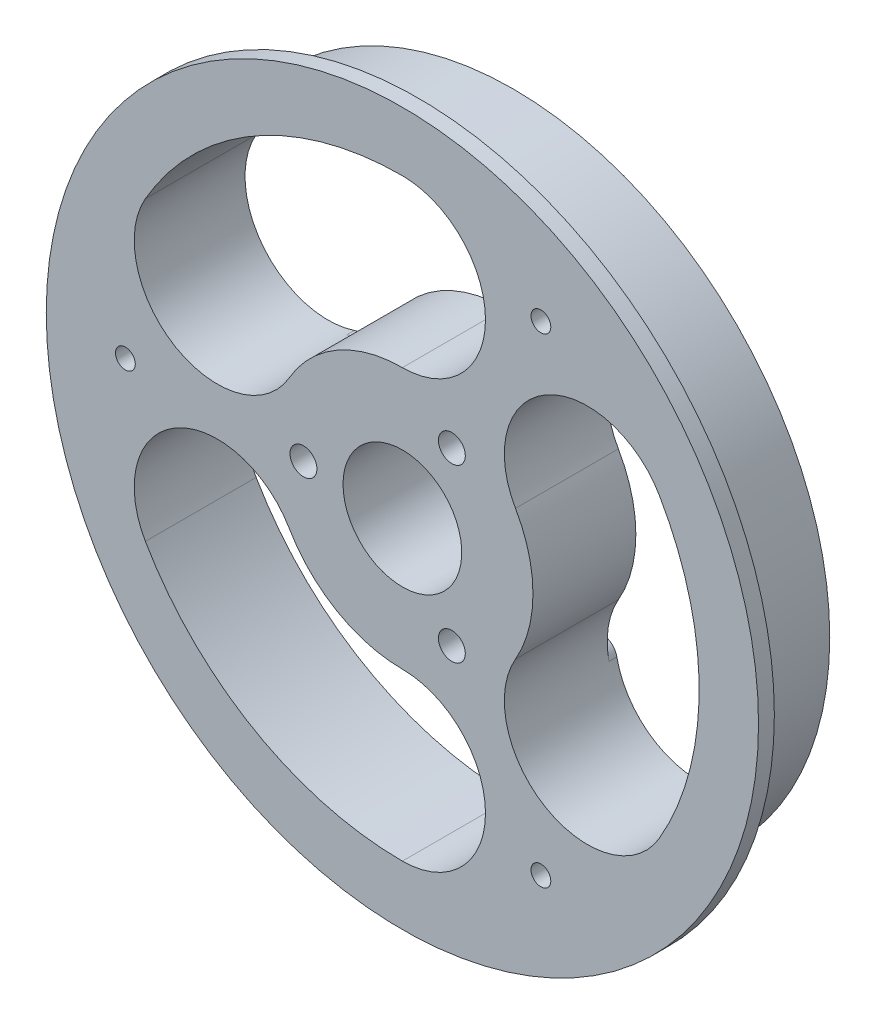
ISO-10303-21;
HEADER;
FILE_DESCRIPTION(('STEP AP214'),'2;1');
FILE_NAME('part.step','',(''),(''),'','','');
FILE_SCHEMA(('AUTOMOTIVE_DESIGN { 1 0 10303 214 1 1 1 1 }'));
ENDSEC;
DATA;
#1=APPLICATION_CONTEXT('core data for automotive mechanical design processes');
#2=APPLICATION_PROTOCOL_DEFINITION('international standard','automotive_design',2000,#1);
#3=PRODUCT_CONTEXT('',#1,'mechanical');
#4=PRODUCT('Part','Part','',(#3));
#5=PRODUCT_RELATED_PRODUCT_CATEGORY('part','',(#4));
#6=PRODUCT_DEFINITION_FORMATION('','',#4);
#7=PRODUCT_DEFINITION_CONTEXT('part definition',#1,'design');
#8=PRODUCT_DEFINITION('design','',#6,#7);
#9=PRODUCT_DEFINITION_SHAPE('','',#8);
#10=(LENGTH_UNIT() NAMED_UNIT(*) SI_UNIT(.MILLI.,.METRE.));
#11=(NAMED_UNIT(*) PLANE_ANGLE_UNIT() SI_UNIT($,.RADIAN.));
#12=(NAMED_UNIT(*) SI_UNIT($,.STERADIAN.) SOLID_ANGLE_UNIT());
#13=UNCERTAINTY_MEASURE_WITH_UNIT(LENGTH_MEASURE(1.E-05),#10,'distance_accuracy_value','');
#14=(GEOMETRIC_REPRESENTATION_CONTEXT(3) GLOBAL_UNCERTAINTY_ASSIGNED_CONTEXT((#13)) GLOBAL_UNIT_ASSIGNED_CONTEXT((#10,
#11,#12)) REPRESENTATION_CONTEXT('',''));
#15=CARTESIAN_POINT('',(0.,0.,0.));
#16=DIRECTION('',(0.,0.,1.));
#17=DIRECTION('',(1.,0.,0.));
#18=AXIS2_PLACEMENT_3D('',#15,#16,#17);
#19=CARTESIAN_POINT('',(0.,0.,0.));
#20=DIRECTION('',(0.,0.,1.));
#21=DIRECTION('',(1.,0.,0.));
#22=AXIS2_PLACEMENT_3D('',#19,#20,#21);
#23=CYLINDRICAL_SURFACE('',#22,7.5);
#24=CARTESIAN_POINT('',(0.,0.,14.));
#25=DIRECTION('',(0.,0.,-1.));
#26=DIRECTION('',(-1.,0.,0.));
#27=AXIS2_PLACEMENT_3D('',#24,#25,#26);
#28=CIRCLE('',#27,7.5);
#29=CARTESIAN_POINT('',(-7.5,0.,14.));
#30=VERTEX_POINT('',#29);
#31=EDGE_CURVE('E316',#30,#30,#28,.T.);
#32=ORIENTED_EDGE('',*,*,#31,.F.);
#33=EDGE_LOOP('',(#32));
#34=FACE_BOUND('',#33,.T.);
#35=CARTESIAN_POINT('',(0.,0.,1.));
#36=DIRECTION('',(0.,0.,-1.));
#37=DIRECTION('',(-1.,0.,0.));
#38=AXIS2_PLACEMENT_3D('',#35,#36,#37);
#39=CIRCLE('',#38,7.5);
#40=CARTESIAN_POINT('',(-7.5,0.,1.));
#41=VERTEX_POINT('',#40);
#42=EDGE_CURVE('E447',#41,#41,#39,.T.);
#43=ORIENTED_EDGE('',*,*,#42,.T.);
#44=EDGE_LOOP('',(#43));
#45=FACE_BOUND('',#44,.T.);
#46=ADVANCED_FACE('F48',(#34,#45),#23,.F.);
#47=CARTESIAN_POINT('',(6.25000000000005,-10.8253175473055,14.));
#48=DIRECTION('',(0.,0.,1.));
#49=DIRECTION('',(1.,0.,0.));
#50=AXIS2_PLACEMENT_3D('',#47,#48,#49);
#51=CYLINDRICAL_SURFACE('',#50,1.7);
#52=CARTESIAN_POINT('',(6.25000000000005,-10.8253175473055,14.));
#53=DIRECTION('',(0.,0.,1.));
#54=DIRECTION('',(1.,0.,0.));
#55=AXIS2_PLACEMENT_3D('',#52,#53,#54);
#56=CIRCLE('',#55,1.7);
#57=CARTESIAN_POINT('',(7.95000000000005,-10.8253175473055,14.));
#58=VERTEX_POINT('',#57);
#59=EDGE_CURVE('E313',#58,#58,#56,.T.);
#60=ORIENTED_EDGE('',*,*,#59,.T.);
#61=EDGE_LOOP('',(#60));
#62=FACE_BOUND('',#61,.T.);
#63=CARTESIAN_POINT('',(6.25000000000005,-10.8253175473055,0.999999999999999));
#64=DIRECTION('',(0.,0.,-1.));
#65=DIRECTION('',(-1.,0.,0.));
#66=AXIS2_PLACEMENT_3D('',#63,#64,#65);
#67=CIRCLE('',#66,1.7);
#68=CARTESIAN_POINT('',(4.55000000000006,-10.8253175473055,0.999999999999999));
#69=VERTEX_POINT('',#68);
#70=EDGE_CURVE('E444',#69,#69,#67,.F.);
#71=ORIENTED_EDGE('',*,*,#70,.F.);
#72=EDGE_LOOP('',(#71));
#73=FACE_BOUND('',#72,.T.);
#74=ADVANCED_FACE('F537',(#62,#73),#51,.F.);
#75=CARTESIAN_POINT('',(-12.5,0.,14.));
#76=DIRECTION('',(0.,0.,1.));
#77=DIRECTION('',(1.,0.,0.));
#78=AXIS2_PLACEMENT_3D('',#75,#76,#77);
#79=CYLINDRICAL_SURFACE('',#78,1.7);
#80=CARTESIAN_POINT('',(-12.5,0.,14.));
#81=DIRECTION('',(0.,0.,1.));
#82=DIRECTION('',(1.,0.,0.));
#83=AXIS2_PLACEMENT_3D('',#80,#81,#82);
#84=CIRCLE('',#83,1.7);
#85=CARTESIAN_POINT('',(-10.8,0.,14.));
#86=VERTEX_POINT('',#85);
#87=EDGE_CURVE('E310',#86,#86,#84,.T.);
#88=ORIENTED_EDGE('',*,*,#87,.T.);
#89=EDGE_LOOP('',(#88));
#90=FACE_BOUND('',#89,.T.);
#91=CARTESIAN_POINT('',(-12.5,0.,0.999999999999999));
#92=DIRECTION('',(0.,0.,-1.));
#93=DIRECTION('',(-1.,0.,0.));
#94=AXIS2_PLACEMENT_3D('',#91,#92,#93);
#95=CIRCLE('',#94,1.7);
#96=CARTESIAN_POINT('',(-14.2,0.,0.999999999999999));
#97=VERTEX_POINT('',#96);
#98=EDGE_CURVE('E441',#97,#97,#95,.F.);
#99=ORIENTED_EDGE('',*,*,#98,.F.);
#100=EDGE_LOOP('',(#99));
#101=FACE_BOUND('',#100,.T.);
#102=ADVANCED_FACE('F543',(#90,#101),#79,.F.);
#103=CARTESIAN_POINT('',(6.24999999999997,10.8253175473055,14.));
#104=DIRECTION('',(0.,0.,1.));
#105=DIRECTION('',(1.,0.,0.));
#106=AXIS2_PLACEMENT_3D('',#103,#104,#105);
#107=CYLINDRICAL_SURFACE('',#106,1.7);
#108=CARTESIAN_POINT('',(6.24999999999997,10.8253175473055,14.));
#109=DIRECTION('',(0.,0.,1.));
#110=DIRECTION('',(1.,0.,0.));
#111=AXIS2_PLACEMENT_3D('',#108,#109,#110);
#112=CIRCLE('',#111,1.7);
#113=CARTESIAN_POINT('',(7.94999999999997,10.8253175473055,14.));
#114=VERTEX_POINT('',#113);
#115=EDGE_CURVE('E300',#114,#114,#112,.T.);
#116=ORIENTED_EDGE('',*,*,#115,.T.);
#117=EDGE_LOOP('',(#116));
#118=FACE_BOUND('',#117,.T.);
#119=CARTESIAN_POINT('',(6.24999999999997,10.8253175473055,0.999999999999999));
#120=DIRECTION('',(0.,0.,-1.));
#121=DIRECTION('',(-1.,0.,0.));
#122=AXIS2_PLACEMENT_3D('',#119,#120,#121);
#123=CIRCLE('',#122,1.7);
#124=CARTESIAN_POINT('',(4.54999999999997,10.8253175473055,0.999999999999999));
#125=VERTEX_POINT('',#124);
#126=EDGE_CURVE('E438',#125,#125,#123,.F.);
#127=ORIENTED_EDGE('',*,*,#126,.F.);
#128=EDGE_LOOP('',(#127));
#129=FACE_BOUND('',#128,.T.);
#130=ADVANCED_FACE('F731',(#118,#129),#107,.F.);
#131=CARTESIAN_POINT('',(0.,0.,14.));
#132=DIRECTION('',(0.,0.,-1.));
#133=DIRECTION('',(-1.,0.,0.));
#134=AXIS2_PLACEMENT_3D('',#131,#132,#133);
#135=CYLINDRICAL_SURFACE('',#134,16.5);
#136=CARTESIAN_POINT('',(0.,0.,0.999999999999999));
#137=DIRECTION('',(0.,0.,-1.));
#138=DIRECTION('',(-1.,0.,0.));
#139=AXIS2_PLACEMENT_3D('',#136,#137,#138);
#140=CIRCLE('',#139,16.5);
#141=CARTESIAN_POINT('',(-14.2894191624433,8.24999999999997,0.999999999999999));
#142=VERTEX_POINT('',#141);
#143=CARTESIAN_POINT('',(0.,16.5,0.999999999999999));
#144=VERTEX_POINT('',#143);
#145=EDGE_CURVE('E435',#142,#144,#140,.T.);
#146=ORIENTED_EDGE('',*,*,#145,.F.);
#147=DIRECTION('',(0.,0.,-1.));
#148=VECTOR('',#147,1.);
#149=CARTESIAN_POINT('',(-14.2894191624433,8.24999999999997,14.));
#150=LINE('',#149,#148);
#151=CARTESIAN_POINT('',(-14.2894191624433,8.24999999999997,14.));
#152=VERTEX_POINT('',#151);
#153=EDGE_CURVE('E290',#152,#142,#150,.T.);
#154=ORIENTED_EDGE('',*,*,#153,.F.);
#155=CARTESIAN_POINT('',(0.,0.,14.));
#156=DIRECTION('',(0.,0.,1.));
#157=DIRECTION('',(-1.,0.,0.));
#158=AXIS2_PLACEMENT_3D('',#155,#156,#157);
#159=CIRCLE('',#158,16.5);
#160=CARTESIAN_POINT('',(0.,16.5,14.));
#161=VERTEX_POINT('',#160);
#162=EDGE_CURVE('E277',#161,#152,#159,.T.);
#163=ORIENTED_EDGE('',*,*,#162,.F.);
#164=DIRECTION('',(0.,0.,-1.));
#165=VECTOR('',#164,1.);
#166=CARTESIAN_POINT('',(0.,16.5,14.));
#167=LINE('',#166,#165);
#168=EDGE_CURVE('E297',#161,#144,#167,.T.);
#169=ORIENTED_EDGE('',*,*,#168,.T.);
#170=EDGE_LOOP('',(#146,#154,#163,#169));
#171=FACE_BOUND('',#170,.T.);
#172=ADVANCED_FACE('F722',(#171),#135,.T.);
#173=CARTESIAN_POINT('',(0.,0.,14.));
#174=DIRECTION('',(0.,0.,-1.));
#175=DIRECTION('',(-1.,0.,0.));
#176=AXIS2_PLACEMENT_3D('',#173,#174,#175);
#177=CYLINDRICAL_SURFACE('',#176,16.5);
#178=CARTESIAN_POINT('',(0.,0.,0.999999999999999));
#179=DIRECTION('',(0.,0.,-1.));
#180=DIRECTION('',(-1.,0.,0.));
#181=AXIS2_PLACEMENT_3D('',#178,#179,#180);
#182=CIRCLE('',#181,16.5);
#183=CARTESIAN_POINT('',(0.,-16.5,0.999999999999999));
#184=VERTEX_POINT('',#183);
#185=CARTESIAN_POINT('',(-14.2894191624432,-8.25,0.999999999999999));
#186=VERTEX_POINT('',#185);
#187=EDGE_CURVE('E430',#184,#186,#182,.T.);
#188=ORIENTED_EDGE('',*,*,#187,.F.);
#189=DIRECTION('',(0.,0.,-1.));
#190=VECTOR('',#189,1.);
#191=CARTESIAN_POINT('',(0.,-16.5,14.));
#192=LINE('',#191,#190);
#193=CARTESIAN_POINT('',(0.,-16.5,14.));
#194=VERTEX_POINT('',#193);
#195=EDGE_CURVE('E258',#194,#184,#192,.T.);
#196=ORIENTED_EDGE('',*,*,#195,.F.);
#197=CARTESIAN_POINT('',(0.,0.,14.));
#198=DIRECTION('',(0.,0.,1.));
#199=DIRECTION('',(-1.,0.,0.));
#200=AXIS2_PLACEMENT_3D('',#197,#198,#199);
#201=CIRCLE('',#200,16.5);
#202=CARTESIAN_POINT('',(-14.2894191624432,-8.25,14.));
#203=VERTEX_POINT('',#202);
#204=EDGE_CURVE('E245',#203,#194,#201,.T.);
#205=ORIENTED_EDGE('',*,*,#204,.F.);
#206=DIRECTION('',(0.,0.,-1.));
#207=VECTOR('',#206,1.);
#208=CARTESIAN_POINT('',(-14.2894191624432,-8.25,14.));
#209=LINE('',#208,#207);
#210=EDGE_CURVE('E266',#203,#186,#209,.T.);
#211=ORIENTED_EDGE('',*,*,#210,.T.);
#212=EDGE_LOOP('',(#188,#196,#205,#211));
#213=FACE_BOUND('',#212,.T.);
#214=ADVANCED_FACE('F508',(#213),#177,.T.);
#215=CARTESIAN_POINT('',(0.,0.,14.));
#216=DIRECTION('',(0.,0.,-1.));
#217=DIRECTION('',(-1.,0.,0.));
#218=AXIS2_PLACEMENT_3D('',#215,#216,#217);
#219=CYLINDRICAL_SURFACE('',#218,16.5);
#220=CARTESIAN_POINT('',(0.,0.,0.999999999999999));
#221=DIRECTION('',(0.,0.,-1.));
#222=DIRECTION('',(-1.,0.,0.));
#223=AXIS2_PLACEMENT_3D('',#220,#221,#222);
#224=CIRCLE('',#223,16.5);
#225=CARTESIAN_POINT('',(14.2894191624432,8.25000000000002,0.999999999999999));
#226=VERTEX_POINT('',#225);
#227=CARTESIAN_POINT('',(14.2894191624432,-8.25000000000001,0.999999999999999));
#228=VERTEX_POINT('',#227);
#229=EDGE_CURVE('E212',#226,#228,#224,.T.);
#230=ORIENTED_EDGE('',*,*,#229,.F.);
#231=DIRECTION('',(0.,0.,-1.));
#232=VECTOR('',#231,1.);
#233=CARTESIAN_POINT('',(14.2894191624432,8.25000000000002,14.));
#234=LINE('',#233,#232);
#235=CARTESIAN_POINT('',(14.2894191624432,8.25000000000002,14.));
#236=VERTEX_POINT('',#235);
#237=EDGE_CURVE('E223',#236,#226,#234,.T.);
#238=ORIENTED_EDGE('',*,*,#237,.F.);
#239=CARTESIAN_POINT('',(0.,0.,14.));
#240=DIRECTION('',(0.,0.,1.));
#241=DIRECTION('',(-1.,0.,0.));
#242=AXIS2_PLACEMENT_3D('',#239,#240,#241);
#243=CIRCLE('',#242,16.5);
#244=CARTESIAN_POINT('',(14.2894191624432,-8.25000000000001,14.));
#245=VERTEX_POINT('',#244);
#246=EDGE_CURVE('E469',#245,#236,#243,.T.);
#247=ORIENTED_EDGE('',*,*,#246,.F.);
#248=DIRECTION('',(0.,0.,-1.));
#249=VECTOR('',#248,1.);
#250=CARTESIAN_POINT('',(14.2894191624432,-8.25000000000001,14.));
#251=LINE('',#250,#249);
#252=EDGE_CURVE('E225',#245,#228,#251,.T.);
#253=ORIENTED_EDGE('',*,*,#252,.T.);
#254=EDGE_LOOP('',(#230,#238,#247,#253));
#255=FACE_BOUND('',#254,.T.);
#256=ADVANCED_FACE('F221',(#255),#219,.T.);
#257=CARTESIAN_POINT('',(0.,0.,0.));
#258=DIRECTION('',(0.,0.,1.));
#259=DIRECTION('',(1.,0.,0.));
#260=AXIS2_PLACEMENT_3D('',#257,#258,#259);
#261=PLANE('',#260);
#262=CARTESIAN_POINT('',(17.4999999999999,30.3108891324554,0.));
#263=DIRECTION('',(0.,0.,-1.));
#264=DIRECTION('',(-1.,0.,0.));
#265=AXIS2_PLACEMENT_3D('',#262,#263,#264);
#266=CIRCLE('',#265,1.25);
#267=CARTESIAN_POINT('',(16.2499999999999,30.3108891324554,0.));
#268=VERTEX_POINT('',#267);
#269=EDGE_CURVE('E450',#268,#268,#266,.T.);
#270=ORIENTED_EDGE('',*,*,#269,.F.);
#271=EDGE_LOOP('',(#270));
#272=FACE_BOUND('',#271,.T.);
#273=CARTESIAN_POINT('',(-35.,0.,0.));
#274=DIRECTION('',(0.,0.,-1.));
#275=DIRECTION('',(-1.,0.,0.));
#276=AXIS2_PLACEMENT_3D('',#273,#274,#275);
#277=CIRCLE('',#276,1.25);
#278=CARTESIAN_POINT('',(-36.25,0.,0.));
#279=VERTEX_POINT('',#278);
#280=EDGE_CURVE('E456',#279,#279,#277,.T.);
#281=ORIENTED_EDGE('',*,*,#280,.F.);
#282=EDGE_LOOP('',(#281));
#283=FACE_BOUND('',#282,.T.);
#284=CARTESIAN_POINT('',(17.4999999999998,-30.3108891324555,0.));
#285=DIRECTION('',(0.,0.,-1.));
#286=DIRECTION('',(-1.,0.,0.));
#287=AXIS2_PLACEMENT_3D('',#284,#285,#286);
#288=CIRCLE('',#287,1.25);
#289=CARTESIAN_POINT('',(16.2499999999998,-30.3108891324555,0.));
#290=VERTEX_POINT('',#289);
#291=EDGE_CURVE('E462',#290,#290,#288,.T.);
#292=ORIENTED_EDGE('',*,*,#291,.F.);
#293=EDGE_LOOP('',(#292));
#294=FACE_BOUND('',#293,.T.);
#295=CARTESIAN_POINT('',(-23.3826859021799,13.4999999999999,0.));
#296=DIRECTION('',(0.,0.,-1.));
#297=DIRECTION('',(-1.,0.,0.));
#298=AXIS2_PLACEMENT_3D('',#295,#296,#297);
#299=CIRCLE('',#298,10.5);
#300=CARTESIAN_POINT('',(-20.0631167799157,3.53855126788723,0.));
#301=VERTEX_POINT('',#300);
#302=CARTESIAN_POINT('',(-32.4759526419165,18.7499999999999,0.));
#303=VERTEX_POINT('',#302);
#304=EDGE_CURVE('E269',#301,#303,#299,.T.);
#305=ORIENTED_EDGE('',*,*,#304,.F.);
#306=CARTESIAN_POINT('',(-19.4308178994844,1.64113246177052,0.));
#307=DIRECTION('',(0.,0.,1.));
#308=DIRECTION('',(1.,0.,0.));
#309=AXIS2_PLACEMENT_3D('',#306,#307,#308);
#310=CIRCLE('',#309,2.);
#311=CARTESIAN_POINT('',(-17.4379134995373,1.47281118364021,0.));
#312=VERTEX_POINT('',#311);
#313=EDGE_CURVE('E342',#301,#312,#310,.F.);
#314=ORIENTED_EDGE('',*,*,#313,.T.);
#315=CARTESIAN_POINT('',(0.,0.,0.));
#316=DIRECTION('',(0.,0.,-1.));
#317=DIRECTION('',(-1.,0.,0.));
#318=AXIS2_PLACEMENT_3D('',#315,#316,#317);
#319=CIRCLE('',#318,17.5);
#320=CARTESIAN_POINT('',(-17.4379134995373,-1.47281118364024,0.));
#321=VERTEX_POINT('',#320);
#322=EDGE_CURVE('E420',#321,#312,#319,.T.);
#323=ORIENTED_EDGE('',*,*,#322,.F.);
#324=CARTESIAN_POINT('',(-19.4308178994844,-1.64113246177056,0.));
#325=DIRECTION('',(0.,0.,1.));
#326=DIRECTION('',(1.,0.,0.));
#327=AXIS2_PLACEMENT_3D('',#324,#325,#326);
#328=CIRCLE('',#327,2.);
#329=CARTESIAN_POINT('',(-20.0631167799157,-3.53855126788727,0.));
#330=VERTEX_POINT('',#329);
#331=EDGE_CURVE('E340',#321,#330,#328,.F.);
#332=ORIENTED_EDGE('',*,*,#331,.T.);
#333=CARTESIAN_POINT('',(-23.3826859021798,-13.5,0.));
#334=DIRECTION('',(0.,0.,-1.));
#335=DIRECTION('',(-1.,0.,0.));
#336=AXIS2_PLACEMENT_3D('',#333,#334,#335);
#337=CIRCLE('',#336,10.5);
#338=CARTESIAN_POINT('',(-32.4759526419165,-18.75,0.));
#339=VERTEX_POINT('',#338);
#340=EDGE_CURVE('E249',#339,#330,#337,.T.);
#341=ORIENTED_EDGE('',*,*,#340,.F.);
#342=CARTESIAN_POINT('',(0.,0.,0.));
#343=DIRECTION('',(0.,0.,-1.));
#344=DIRECTION('',(-1.,0.,0.));
#345=AXIS2_PLACEMENT_3D('',#342,#343,#344);
#346=CIRCLE('',#345,37.5);
#347=CARTESIAN_POINT('',(0.,-37.5,0.));
#348=VERTEX_POINT('',#347);
#349=EDGE_CURVE('E261',#348,#339,#346,.T.);
#350=ORIENTED_EDGE('',*,*,#349,.F.);
#351=CARTESIAN_POINT('',(0.,-27.,0.));
#352=DIRECTION('',(0.,0.,-1.));
#353=DIRECTION('',(-1.,0.,0.));
#354=AXIS2_PLACEMENT_3D('',#351,#352,#353);
#355=CIRCLE('',#354,10.5);
#356=CARTESIAN_POINT('',(6.96708309937386,-19.1444444444444,0.));
#357=VERTEX_POINT('',#356);
#358=EDGE_CURVE('E259',#357,#348,#355,.T.);
#359=ORIENTED_EDGE('',*,*,#358,.F.);
#360=CARTESIAN_POINT('',(8.29414654687363,-17.6481481481481,0.));
#361=DIRECTION('',(0.,0.,1.));
#362=DIRECTION('',(1.,0.,0.));
#363=AXIS2_PLACEMENT_3D('',#360,#361,#362);
#364=CIRCLE('',#363,2.);
#365=CARTESIAN_POINT('',(7.44346484975839,-15.838081671415,0.));
#366=VERTEX_POINT('',#365);
#367=EDGE_CURVE('E338',#357,#366,#364,.F.);
#368=ORIENTED_EDGE('',*,*,#367,.T.);
#369=CARTESIAN_POINT('',(9.99444864977892,-14.3652704877748,0.));
#370=VERTEX_POINT('',#369);
#371=EDGE_CURVE('E423',#370,#366,#319,.T.);
#372=ORIENTED_EDGE('',*,*,#371,.F.);
#373=CARTESIAN_POINT('',(11.1366713526108,-16.0070156863776,0.));
#374=DIRECTION('',(0.,0.,1.));
#375=DIRECTION('',(1.,0.,0.));
#376=AXIS2_PLACEMENT_3D('',#373,#374,#375);
#377=CIRCLE('',#376,2.);
#378=CARTESIAN_POINT('',(13.0960336805418,-15.6058931765572,0.));
#379=VERTEX_POINT('',#378);
#380=EDGE_CURVE('E336',#370,#379,#377,.F.);
#381=ORIENTED_EDGE('',*,*,#380,.T.);
#382=CARTESIAN_POINT('',(23.3826859021798,-13.5,0.));
#383=DIRECTION('',(0.,0.,-1.));
#384=DIRECTION('',(-1.,0.,0.));
#385=AXIS2_PLACEMENT_3D('',#382,#383,#384);
#386=CIRCLE('',#385,10.5);
#387=CARTESIAN_POINT('',(32.4759526419165,-18.75,0.));
#388=VERTEX_POINT('',#387);
#389=EDGE_CURVE('E471',#388,#379,#386,.T.);
#390=ORIENTED_EDGE('',*,*,#389,.F.);
#391=CARTESIAN_POINT('',(0.,0.,0.));
#392=DIRECTION('',(0.,0.,-1.));
#393=DIRECTION('',(-1.,0.,0.));
#394=AXIS2_PLACEMENT_3D('',#391,#392,#393);
#395=CIRCLE('',#394,37.5);
#396=CARTESIAN_POINT('',(32.4759526419164,18.7500000000001,0.));
#397=VERTEX_POINT('',#396);
#398=EDGE_CURVE('E476',#397,#388,#395,.T.);
#399=ORIENTED_EDGE('',*,*,#398,.F.);
#400=CARTESIAN_POINT('',(23.3826859021798,13.5,0.));
#401=DIRECTION('',(0.,0.,-1.));
#402=DIRECTION('',(-1.,0.,0.));
#403=AXIS2_PLACEMENT_3D('',#400,#401,#402);
#404=CIRCLE('',#403,10.5);
#405=CARTESIAN_POINT('',(13.0960336805418,15.6058931765572,0.));
#406=VERTEX_POINT('',#405);
#407=EDGE_CURVE('E468',#406,#397,#404,.T.);
#408=ORIENTED_EDGE('',*,*,#407,.F.);
#409=CARTESIAN_POINT('',(11.1366713526108,16.0070156863776,0.));
#410=DIRECTION('',(0.,0.,1.));
#411=DIRECTION('',(1.,0.,0.));
#412=AXIS2_PLACEMENT_3D('',#409,#410,#411);
#413=CIRCLE('',#412,2.);
#414=CARTESIAN_POINT('',(9.9944486497789,14.3652704877748,0.));
#415=VERTEX_POINT('',#414);
#416=EDGE_CURVE('E332',#406,#415,#413,.F.);
#417=ORIENTED_EDGE('',*,*,#416,.T.);
#418=CARTESIAN_POINT('',(7.44346484975835,15.838081671415,0.));
#419=VERTEX_POINT('',#418);
#420=EDGE_CURVE('E397',#419,#415,#319,.T.);
#421=ORIENTED_EDGE('',*,*,#420,.F.);
#422=CARTESIAN_POINT('',(8.29414654687359,17.6481481481481,0.));
#423=DIRECTION('',(0.,0.,1.));
#424=DIRECTION('',(1.,0.,0.));
#425=AXIS2_PLACEMENT_3D('',#422,#423,#424);
#426=CIRCLE('',#425,2.);
#427=CARTESIAN_POINT('',(6.96708309937381,19.1444444444444,0.));
#428=VERTEX_POINT('',#427);
#429=EDGE_CURVE('E334',#419,#428,#426,.F.);
#430=ORIENTED_EDGE('',*,*,#429,.T.);
#431=CARTESIAN_POINT('',(0.,27.,0.));
#432=DIRECTION('',(0.,0.,-1.));
#433=DIRECTION('',(-1.,0.,0.));
#434=AXIS2_PLACEMENT_3D('',#431,#432,#433);
#435=CIRCLE('',#434,10.5);
#436=CARTESIAN_POINT('',(0.,37.5,0.));
#437=VERTEX_POINT('',#436);
#438=EDGE_CURVE('E281',#437,#428,#435,.T.);
#439=ORIENTED_EDGE('',*,*,#438,.F.);
#440=CARTESIAN_POINT('',(0.,0.,0.));
#441=DIRECTION('',(0.,0.,-1.));
#442=DIRECTION('',(-1.,0.,0.));
#443=AXIS2_PLACEMENT_3D('',#440,#441,#442);
#444=CIRCLE('',#443,37.5);
#445=EDGE_CURVE('E292',#303,#437,#444,.T.);
#446=ORIENTED_EDGE('',*,*,#445,.F.);
#447=EDGE_LOOP('',(#305,#314,#323,#332,#341,#350,#359,#368,#372,#381,#390,#399,#408,#417,#421,
#430,#439,#446));
#448=FACE_BOUND('',#447,.T.);
#449=CARTESIAN_POINT('',(0.,0.,0.));
#450=DIRECTION('',(0.,0.,1.));
#451=DIRECTION('',(1.,0.,0.));
#452=AXIS2_PLACEMENT_3D('',#449,#450,#451);
#453=CIRCLE('',#452,40.);
#454=CARTESIAN_POINT('',(40.,0.,0.));
#455=VERTEX_POINT('',#454);
#456=EDGE_CURVE('E323',#455,#455,#453,.T.);
#457=ORIENTED_EDGE('',*,*,#456,.F.);
#458=EDGE_LOOP('',(#457));
#459=FACE_BOUND('',#458,.T.);
#460=ADVANCED_FACE('F394',(#272,#283,#294,#448,#459),#261,.F.);
#461=CARTESIAN_POINT('',(0.,0.,14.));
#462=DIRECTION('',(0.,0.,1.));
#463=DIRECTION('',(1.,0.,0.));
#464=AXIS2_PLACEMENT_3D('',#461,#462,#463);
#465=PLANE('',#464);
#466=CARTESIAN_POINT('',(17.4999999999999,30.3108891324554,14.));
#467=DIRECTION('',(0.,0.,-1.));
#468=DIRECTION('',(-1.,0.,0.));
#469=AXIS2_PLACEMENT_3D('',#466,#467,#468);
#470=CIRCLE('',#469,1.25);
#471=CARTESIAN_POINT('',(16.2499999999999,30.3108891324554,14.));
#472=VERTEX_POINT('',#471);
#473=EDGE_CURVE('E453',#472,#472,#470,.T.);
#474=ORIENTED_EDGE('',*,*,#473,.T.);
#475=EDGE_LOOP('',(#474));
#476=FACE_BOUND('',#475,.T.);
#477=CARTESIAN_POINT('',(-35.,0.,14.));
#478=DIRECTION('',(0.,0.,-1.));
#479=DIRECTION('',(-1.,0.,0.));
#480=AXIS2_PLACEMENT_3D('',#477,#478,#479);
#481=CIRCLE('',#480,1.24999999999999);
#482=CARTESIAN_POINT('',(-36.25,0.,14.));
#483=VERTEX_POINT('',#482);
#484=EDGE_CURVE('E459',#483,#483,#481,.T.);
#485=ORIENTED_EDGE('',*,*,#484,.T.);
#486=EDGE_LOOP('',(#485));
#487=FACE_BOUND('',#486,.T.);
#488=CARTESIAN_POINT('',(17.4999999999998,-30.3108891324555,14.));
#489=DIRECTION('',(0.,0.,-1.));
#490=DIRECTION('',(-1.,0.,0.));
#491=AXIS2_PLACEMENT_3D('',#488,#489,#490);
#492=CIRCLE('',#491,1.25);
#493=CARTESIAN_POINT('',(16.2499999999998,-30.3108891324555,14.));
#494=VERTEX_POINT('',#493);
#495=EDGE_CURVE('E465',#494,#494,#492,.T.);
#496=ORIENTED_EDGE('',*,*,#495,.T.);
#497=EDGE_LOOP('',(#496));
#498=FACE_BOUND('',#497,.T.);
#499=ORIENTED_EDGE('',*,*,#246,.T.);
#500=CARTESIAN_POINT('',(23.3826859021798,13.5,14.));
#501=DIRECTION('',(0.,0.,-1.));
#502=DIRECTION('',(-1.,0.,0.));
#503=AXIS2_PLACEMENT_3D('',#500,#501,#502);
#504=CIRCLE('',#503,10.5);
#505=CARTESIAN_POINT('',(32.4759526419164,18.7500000000001,14.));
#506=VERTEX_POINT('',#505);
#507=EDGE_CURVE('E232',#236,#506,#504,.T.);
#508=ORIENTED_EDGE('',*,*,#507,.T.);
#509=CARTESIAN_POINT('',(0.,0.,14.));
#510=DIRECTION('',(0.,0.,-1.));
#511=DIRECTION('',(-1.,0.,0.));
#512=AXIS2_PLACEMENT_3D('',#509,#510,#511);
#513=CIRCLE('',#512,37.5);
#514=CARTESIAN_POINT('',(32.4759526419165,-18.75,14.));
#515=VERTEX_POINT('',#514);
#516=EDGE_CURVE('E241',#506,#515,#513,.T.);
#517=ORIENTED_EDGE('',*,*,#516,.T.);
#518=CARTESIAN_POINT('',(23.3826859021798,-13.5,14.));
#519=DIRECTION('',(0.,0.,-1.));
#520=DIRECTION('',(-1.,0.,0.));
#521=AXIS2_PLACEMENT_3D('',#518,#519,#520);
#522=CIRCLE('',#521,10.5);
#523=EDGE_CURVE('E235',#515,#245,#522,.T.);
#524=ORIENTED_EDGE('',*,*,#523,.T.);
#525=EDGE_LOOP('',(#499,#508,#517,#524));
#526=FACE_BOUND('',#525,.T.);
#527=ORIENTED_EDGE('',*,*,#204,.T.);
#528=CARTESIAN_POINT('',(0.,-27.,14.));
#529=DIRECTION('',(0.,0.,-1.));
#530=DIRECTION('',(-1.,0.,0.));
#531=AXIS2_PLACEMENT_3D('',#528,#529,#530);
#532=CIRCLE('',#531,10.5);
#533=CARTESIAN_POINT('',(0.,-37.5,14.));
#534=VERTEX_POINT('',#533);
#535=EDGE_CURVE('E248',#194,#534,#532,.T.);
#536=ORIENTED_EDGE('',*,*,#535,.T.);
#537=CARTESIAN_POINT('',(0.,0.,14.));
#538=DIRECTION('',(0.,0.,-1.));
#539=DIRECTION('',(-1.,0.,0.));
#540=AXIS2_PLACEMENT_3D('',#537,#538,#539);
#541=CIRCLE('',#540,37.5);
#542=CARTESIAN_POINT('',(-32.4759526419165,-18.75,14.));
#543=VERTEX_POINT('',#542);
#544=EDGE_CURVE('E252',#534,#543,#541,.T.);
#545=ORIENTED_EDGE('',*,*,#544,.T.);
#546=CARTESIAN_POINT('',(-23.3826859021798,-13.5,14.));
#547=DIRECTION('',(0.,0.,-1.));
#548=DIRECTION('',(-1.,0.,0.));
#549=AXIS2_PLACEMENT_3D('',#546,#547,#548);
#550=CIRCLE('',#549,10.5);
#551=EDGE_CURVE('E255',#543,#203,#550,.T.);
#552=ORIENTED_EDGE('',*,*,#551,.T.);
#553=EDGE_LOOP('',(#527,#536,#545,#552));
#554=FACE_BOUND('',#553,.T.);
#555=ORIENTED_EDGE('',*,*,#162,.T.);
#556=CARTESIAN_POINT('',(-23.3826859021799,13.4999999999999,14.));
#557=DIRECTION('',(0.,0.,-1.));
#558=DIRECTION('',(-1.,0.,0.));
#559=AXIS2_PLACEMENT_3D('',#556,#557,#558);
#560=CIRCLE('',#559,10.5);
#561=CARTESIAN_POINT('',(-32.4759526419165,18.7499999999999,14.));
#562=VERTEX_POINT('',#561);
#563=EDGE_CURVE('E280',#152,#562,#560,.T.);
#564=ORIENTED_EDGE('',*,*,#563,.T.);
#565=CARTESIAN_POINT('',(0.,0.,14.));
#566=DIRECTION('',(0.,0.,-1.));
#567=DIRECTION('',(-1.,0.,0.));
#568=AXIS2_PLACEMENT_3D('',#565,#566,#567);
#569=CIRCLE('',#568,37.5);
#570=CARTESIAN_POINT('',(0.,37.5,14.));
#571=VERTEX_POINT('',#570);
#572=EDGE_CURVE('E284',#562,#571,#569,.T.);
#573=ORIENTED_EDGE('',*,*,#572,.T.);
#574=CARTESIAN_POINT('',(0.,27.,14.));
#575=DIRECTION('',(0.,0.,-1.));
#576=DIRECTION('',(-1.,0.,0.));
#577=AXIS2_PLACEMENT_3D('',#574,#575,#576);
#578=CIRCLE('',#577,10.5);
#579=EDGE_CURVE('E287',#571,#161,#578,.T.);
#580=ORIENTED_EDGE('',*,*,#579,.T.);
#581=EDGE_LOOP('',(#555,#564,#573,#580));
#582=FACE_BOUND('',#581,.T.);
#583=ORIENTED_EDGE('',*,*,#115,.F.);
#584=EDGE_LOOP('',(#583));
#585=FACE_BOUND('',#584,.T.);
#586=ORIENTED_EDGE('',*,*,#87,.F.);
#587=EDGE_LOOP('',(#586));
#588=FACE_BOUND('',#587,.T.);
#589=ORIENTED_EDGE('',*,*,#59,.F.);
#590=EDGE_LOOP('',(#589));
#591=FACE_BOUND('',#590,.T.);
#592=CARTESIAN_POINT('',(0.,0.,14.));
#593=DIRECTION('',(0.,0.,1.));
#594=DIRECTION('',(1.,0.,0.));
#595=AXIS2_PLACEMENT_3D('',#592,#593,#594);
#596=CIRCLE('',#595,45.);
#597=CARTESIAN_POINT('',(45.,0.,14.));
#598=VERTEX_POINT('',#597);
#599=EDGE_CURVE('E320',#598,#598,#596,.T.);
#600=ORIENTED_EDGE('',*,*,#599,.T.);
#601=EDGE_LOOP('',(#600));
#602=FACE_BOUND('',#601,.T.);
#603=ORIENTED_EDGE('',*,*,#31,.T.);
#604=EDGE_LOOP('',(#603));
#605=FACE_BOUND('',#604,.T.);
#606=ADVANCED_FACE('F514',(#476,#487,#498,#526,#554,#582,#585,#588,#591,#602,#605),#465,.T.);
#607=CARTESIAN_POINT('',(0.,0.,12.));
#608=DIRECTION('',(0.,0.,-1.));
#609=DIRECTION('',(-1.,0.,0.));
#610=AXIS2_PLACEMENT_3D('',#607,#608,#609);
#611=CYLINDRICAL_SURFACE('',#610,40.);
#612=CARTESIAN_POINT('',(0.,0.,12.));
#613=DIRECTION('',(0.,0.,1.));
#614=DIRECTION('',(1.,0.,0.));
#615=AXIS2_PLACEMENT_3D('',#612,#613,#614);
#616=CIRCLE('',#615,40.);
#617=CARTESIAN_POINT('',(40.,0.,12.));
#618=VERTEX_POINT('',#617);
#619=EDGE_CURVE('E217',#618,#618,#616,.T.);
#620=ORIENTED_EDGE('',*,*,#619,.F.);
#621=EDGE_LOOP('',(#620));
#622=FACE_BOUND('',#621,.T.);
#623=ORIENTED_EDGE('',*,*,#456,.T.);
#624=EDGE_LOOP('',(#623));
#625=FACE_BOUND('',#624,.T.);
#626=ADVANCED_FACE('F552',(#622,#625),#611,.T.);
#627=CARTESIAN_POINT('',(0.,0.,12.));
#628=DIRECTION('',(0.,0.,1.));
#629=DIRECTION('',(1.,0.,0.));
#630=AXIS2_PLACEMENT_3D('',#627,#628,#629);
#631=PLANE('',#630);
#632=CARTESIAN_POINT('',(0.,0.,12.));
#633=DIRECTION('',(0.,0.,1.));
#634=DIRECTION('',(1.,0.,0.));
#635=AXIS2_PLACEMENT_3D('',#632,#633,#634);
#636=CIRCLE('',#635,45.);
#637=CARTESIAN_POINT('',(45.,0.,12.));
#638=VERTEX_POINT('',#637);
#639=EDGE_CURVE('E319',#638,#638,#636,.T.);
#640=ORIENTED_EDGE('',*,*,#639,.F.);
#641=EDGE_LOOP('',(#640));
#642=FACE_BOUND('',#641,.T.);
#643=ORIENTED_EDGE('',*,*,#619,.T.);
#644=EDGE_LOOP('',(#643));
#645=FACE_BOUND('',#644,.T.);
#646=ADVANCED_FACE('F554',(#642,#645),#631,.F.);
#647=CARTESIAN_POINT('',(0.,0.,14.));
#648=DIRECTION('',(0.,0.,-1.));
#649=DIRECTION('',(-1.,0.,0.));
#650=AXIS2_PLACEMENT_3D('',#647,#648,#649);
#651=CYLINDRICAL_SURFACE('',#650,45.);
#652=ORIENTED_EDGE('',*,*,#599,.F.);
#653=EDGE_LOOP('',(#652));
#654=FACE_BOUND('',#653,.T.);
#655=ORIENTED_EDGE('',*,*,#639,.T.);
#656=EDGE_LOOP('',(#655));
#657=FACE_BOUND('',#656,.T.);
#658=ADVANCED_FACE('F557',(#654,#657),#651,.T.);
#659=CARTESIAN_POINT('',(0.,27.,14.));
#660=DIRECTION('',(0.,0.,-1.));
#661=DIRECTION('',(-1.,0.,0.));
#662=AXIS2_PLACEMENT_3D('',#659,#660,#661);
#663=CYLINDRICAL_SURFACE('',#662,10.5);
#664=ORIENTED_EDGE('',*,*,#438,.T.);
#665=DIRECTION('',(0.,0.,-1.));
#666=VECTOR('',#665,1.);
#667=CARTESIAN_POINT('',(6.96708309937381,19.1444444444444,14.));
#668=LINE('',#667,#666);
#669=CARTESIAN_POINT('',(6.96708309937381,19.1444444444444,0.999999999999999));
#670=VERTEX_POINT('',#669);
#671=EDGE_CURVE('E361',#428,#670,#668,.F.);
#672=ORIENTED_EDGE('',*,*,#671,.T.);
#673=CARTESIAN_POINT('',(0.,27.,0.999999999999999));
#674=DIRECTION('',(0.,0.,-1.));
#675=DIRECTION('',(-1.,0.,0.));
#676=AXIS2_PLACEMENT_3D('',#673,#674,#675);
#677=CIRCLE('',#676,10.5);
#678=EDGE_CURVE('E380',#144,#670,#677,.F.);
#679=ORIENTED_EDGE('',*,*,#678,.F.);
#680=ORIENTED_EDGE('',*,*,#168,.F.);
#681=ORIENTED_EDGE('',*,*,#579,.F.);
#682=DIRECTION('',(0.,0.,-1.));
#683=VECTOR('',#682,1.);
#684=CARTESIAN_POINT('',(0.,37.5,14.));
#685=LINE('',#684,#683);
#686=EDGE_CURVE('E301',#571,#437,#685,.T.);
#687=ORIENTED_EDGE('',*,*,#686,.T.);
#688=EDGE_LOOP('',(#664,#672,#679,#680,#681,#687));
#689=FACE_BOUND('',#688,.T.);
#690=ADVANCED_FACE('F399',(#689),#663,.F.);
#691=CARTESIAN_POINT('',(0.,0.,14.));
#692=DIRECTION('',(0.,0.,-1.));
#693=DIRECTION('',(-1.,0.,0.));
#694=AXIS2_PLACEMENT_3D('',#691,#692,#693);
#695=CYLINDRICAL_SURFACE('',#694,37.5);
#696=ORIENTED_EDGE('',*,*,#445,.T.);
#697=ORIENTED_EDGE('',*,*,#686,.F.);
#698=ORIENTED_EDGE('',*,*,#572,.F.);
#699=DIRECTION('',(0.,0.,-1.));
#700=VECTOR('',#699,1.);
#701=CARTESIAN_POINT('',(-32.4759526419165,18.7499999999999,14.));
#702=LINE('',#701,#700);
#703=EDGE_CURVE('E303',#562,#303,#702,.T.);
#704=ORIENTED_EDGE('',*,*,#703,.T.);
#705=EDGE_LOOP('',(#696,#697,#698,#704));
#706=FACE_BOUND('',#705,.T.);
#707=ADVANCED_FACE('F402',(#706),#695,.F.);
#708=CARTESIAN_POINT('',(-23.3826859021799,13.4999999999999,14.));
#709=DIRECTION('',(0.,0.,-1.));
#710=DIRECTION('',(-1.,0.,0.));
#711=AXIS2_PLACEMENT_3D('',#708,#709,#710);
#712=CYLINDRICAL_SURFACE('',#711,10.5);
#713=CARTESIAN_POINT('',(-23.3826859021799,13.4999999999999,0.999999999999999));
#714=DIRECTION('',(0.,0.,-1.));
#715=DIRECTION('',(-1.,0.,0.));
#716=AXIS2_PLACEMENT_3D('',#713,#714,#715);
#717=CIRCLE('',#716,10.5);
#718=CARTESIAN_POINT('',(-20.0631167799157,3.53855126788723,0.999999999999999));
#719=VERTEX_POINT('',#718);
#720=EDGE_CURVE('E410',#719,#142,#717,.F.);
#721=ORIENTED_EDGE('',*,*,#720,.F.);
#722=DIRECTION('',(0.,0.,-1.));
#723=VECTOR('',#722,1.);
#724=CARTESIAN_POINT('',(-20.0631167799157,3.53855126788723,14.));
#725=LINE('',#724,#723);
#726=EDGE_CURVE('E216',#719,#301,#725,.T.);
#727=ORIENTED_EDGE('',*,*,#726,.T.);
#728=ORIENTED_EDGE('',*,*,#304,.T.);
#729=ORIENTED_EDGE('',*,*,#703,.F.);
#730=ORIENTED_EDGE('',*,*,#563,.F.);
#731=ORIENTED_EDGE('',*,*,#153,.T.);
#732=EDGE_LOOP('',(#721,#727,#728,#729,#730,#731));
#733=FACE_BOUND('',#732,.T.);
#734=ADVANCED_FACE('F407',(#733),#712,.F.);
#735=CARTESIAN_POINT('',(-23.3826859021798,-13.5,14.));
#736=DIRECTION('',(0.,0.,-1.));
#737=DIRECTION('',(-1.,0.,0.));
#738=AXIS2_PLACEMENT_3D('',#735,#736,#737);
#739=CYLINDRICAL_SURFACE('',#738,10.5);
#740=ORIENTED_EDGE('',*,*,#340,.T.);
#741=DIRECTION('',(0.,0.,-1.));
#742=VECTOR('',#741,1.);
#743=CARTESIAN_POINT('',(-20.0631167799157,-3.53855126788727,14.));
#744=LINE('',#743,#742);
#745=CARTESIAN_POINT('',(-20.0631167799157,-3.53855126788727,0.999999999999999));
#746=VERTEX_POINT('',#745);
#747=EDGE_CURVE('E348',#330,#746,#744,.F.);
#748=ORIENTED_EDGE('',*,*,#747,.T.);
#749=CARTESIAN_POINT('',(-23.3826859021798,-13.5,0.999999999999999));
#750=DIRECTION('',(0.,0.,-1.));
#751=DIRECTION('',(-1.,0.,0.));
#752=AXIS2_PLACEMENT_3D('',#749,#750,#751);
#753=CIRCLE('',#752,10.5);
#754=EDGE_CURVE('E432',#186,#746,#753,.F.);
#755=ORIENTED_EDGE('',*,*,#754,.F.);
#756=ORIENTED_EDGE('',*,*,#210,.F.);
#757=ORIENTED_EDGE('',*,*,#551,.F.);
#758=DIRECTION('',(0.,0.,-1.));
#759=VECTOR('',#758,1.);
#760=CARTESIAN_POINT('',(-32.4759526419165,-18.75,14.));
#761=LINE('',#760,#759);
#762=EDGE_CURVE('E270',#543,#339,#761,.T.);
#763=ORIENTED_EDGE('',*,*,#762,.T.);
#764=EDGE_LOOP('',(#740,#748,#755,#756,#757,#763));
#765=FACE_BOUND('',#764,.T.);
#766=ADVANCED_FACE('F518',(#765),#739,.F.);
#767=CARTESIAN_POINT('',(0.,0.,14.));
#768=DIRECTION('',(0.,0.,-1.));
#769=DIRECTION('',(-1.,0.,0.));
#770=AXIS2_PLACEMENT_3D('',#767,#768,#769);
#771=CYLINDRICAL_SURFACE('',#770,37.5);
#772=ORIENTED_EDGE('',*,*,#349,.T.);
#773=ORIENTED_EDGE('',*,*,#762,.F.);
#774=ORIENTED_EDGE('',*,*,#544,.F.);
#775=DIRECTION('',(0.,0.,-1.));
#776=VECTOR('',#775,1.);
#777=CARTESIAN_POINT('',(0.,-37.5,14.));
#778=LINE('',#777,#776);
#779=EDGE_CURVE('E272',#534,#348,#778,.T.);
#780=ORIENTED_EDGE('',*,*,#779,.T.);
#781=EDGE_LOOP('',(#772,#773,#774,#780));
#782=FACE_BOUND('',#781,.T.);
#783=ADVANCED_FACE('F527',(#782),#771,.F.);
#784=CARTESIAN_POINT('',(0.,-27.,14.));
#785=DIRECTION('',(0.,0.,-1.));
#786=DIRECTION('',(-1.,0.,0.));
#787=AXIS2_PLACEMENT_3D('',#784,#785,#786);
#788=CYLINDRICAL_SURFACE('',#787,10.5);
#789=CARTESIAN_POINT('',(0.,-27.,0.999999999999999));
#790=DIRECTION('',(0.,0.,-1.));
#791=DIRECTION('',(-1.,0.,0.));
#792=AXIS2_PLACEMENT_3D('',#789,#790,#791);
#793=CIRCLE('',#792,10.5);
#794=CARTESIAN_POINT('',(6.96708309937386,-19.1444444444444,0.999999999999999));
#795=VERTEX_POINT('',#794);
#796=EDGE_CURVE('E428',#795,#184,#793,.F.);
#797=ORIENTED_EDGE('',*,*,#796,.F.);
#798=DIRECTION('',(0.,0.,-1.));
#799=VECTOR('',#798,1.);
#800=CARTESIAN_POINT('',(6.96708309937386,-19.1444444444444,14.));
#801=LINE('',#800,#799);
#802=EDGE_CURVE('E351',#795,#357,#801,.T.);
#803=ORIENTED_EDGE('',*,*,#802,.T.);
#804=ORIENTED_EDGE('',*,*,#358,.T.);
#805=ORIENTED_EDGE('',*,*,#779,.F.);
#806=ORIENTED_EDGE('',*,*,#535,.F.);
#807=ORIENTED_EDGE('',*,*,#195,.T.);
#808=EDGE_LOOP('',(#797,#803,#804,#805,#806,#807));
#809=FACE_BOUND('',#808,.T.);
#810=ADVANCED_FACE('F511',(#809),#788,.F.);
#811=CARTESIAN_POINT('',(23.3826859021798,-13.5,14.));
#812=DIRECTION('',(0.,0.,-1.));
#813=DIRECTION('',(-1.,0.,0.));
#814=AXIS2_PLACEMENT_3D('',#811,#812,#813);
#815=CYLINDRICAL_SURFACE('',#814,10.5);
#816=ORIENTED_EDGE('',*,*,#389,.T.);
#817=DIRECTION('',(0.,0.,-1.));
#818=VECTOR('',#817,1.);
#819=CARTESIAN_POINT('',(13.0960336805418,-15.6058931765572,14.));
#820=LINE('',#819,#818);
#821=CARTESIAN_POINT('',(13.0960336805418,-15.6058931765572,0.999999999999999));
#822=VERTEX_POINT('',#821);
#823=EDGE_CURVE('E358',#379,#822,#820,.F.);
#824=ORIENTED_EDGE('',*,*,#823,.T.);
#825=CARTESIAN_POINT('',(23.3826859021798,-13.5,0.999999999999999));
#826=DIRECTION('',(0.,0.,-1.));
#827=DIRECTION('',(-1.,0.,0.));
#828=AXIS2_PLACEMENT_3D('',#825,#826,#827);
#829=CIRCLE('',#828,10.5);
#830=EDGE_CURVE('E226',#228,#822,#829,.F.);
#831=ORIENTED_EDGE('',*,*,#830,.F.);
#832=ORIENTED_EDGE('',*,*,#252,.F.);
#833=ORIENTED_EDGE('',*,*,#523,.F.);
#834=DIRECTION('',(0.,0.,-1.));
#835=VECTOR('',#834,1.);
#836=CARTESIAN_POINT('',(32.4759526419165,-18.75,14.));
#837=LINE('',#836,#835);
#838=EDGE_CURVE('E238',#515,#388,#837,.T.);
#839=ORIENTED_EDGE('',*,*,#838,.T.);
#840=EDGE_LOOP('',(#816,#824,#831,#832,#833,#839));
#841=FACE_BOUND('',#840,.T.);
#842=ADVANCED_FACE('F483',(#841),#815,.F.);
#843=CARTESIAN_POINT('',(0.,0.,14.));
#844=DIRECTION('',(0.,0.,-1.));
#845=DIRECTION('',(-1.,0.,0.));
#846=AXIS2_PLACEMENT_3D('',#843,#844,#845);
#847=CYLINDRICAL_SURFACE('',#846,37.5);
#848=ORIENTED_EDGE('',*,*,#398,.T.);
#849=ORIENTED_EDGE('',*,*,#838,.F.);
#850=ORIENTED_EDGE('',*,*,#516,.F.);
#851=DIRECTION('',(0.,0.,-1.));
#852=VECTOR('',#851,1.);
#853=CARTESIAN_POINT('',(32.4759526419164,18.7500000000001,14.));
#854=LINE('',#853,#852);
#855=EDGE_CURVE('E234',#506,#397,#854,.T.);
#856=ORIENTED_EDGE('',*,*,#855,.T.);
#857=EDGE_LOOP('',(#848,#849,#850,#856));
#858=FACE_BOUND('',#857,.T.);
#859=ADVANCED_FACE('F488',(#858),#847,.F.);
#860=CARTESIAN_POINT('',(23.3826859021798,13.5,14.));
#861=DIRECTION('',(0.,0.,-1.));
#862=DIRECTION('',(-1.,0.,0.));
#863=AXIS2_PLACEMENT_3D('',#860,#861,#862);
#864=CYLINDRICAL_SURFACE('',#863,10.5);
#865=CARTESIAN_POINT('',(23.3826859021798,13.5,0.999999999999999));
#866=DIRECTION('',(0.,0.,-1.));
#867=DIRECTION('',(-1.,0.,0.));
#868=AXIS2_PLACEMENT_3D('',#865,#866,#867);
#869=CIRCLE('',#868,10.5);
#870=CARTESIAN_POINT('',(13.0960336805418,15.6058931765572,0.999999999999999));
#871=VERTEX_POINT('',#870);
#872=EDGE_CURVE('E63',#871,#226,#869,.F.);
#873=ORIENTED_EDGE('',*,*,#872,.F.);
#874=DIRECTION('',(0.,0.,-1.));
#875=VECTOR('',#874,1.);
#876=CARTESIAN_POINT('',(13.0960336805418,15.6058931765572,14.));
#877=LINE('',#876,#875);
#878=EDGE_CURVE('E367',#871,#406,#877,.T.);
#879=ORIENTED_EDGE('',*,*,#878,.T.);
#880=ORIENTED_EDGE('',*,*,#407,.T.);
#881=ORIENTED_EDGE('',*,*,#855,.F.);
#882=ORIENTED_EDGE('',*,*,#507,.F.);
#883=ORIENTED_EDGE('',*,*,#237,.T.);
#884=EDGE_LOOP('',(#873,#879,#880,#881,#882,#883));
#885=FACE_BOUND('',#884,.T.);
#886=ADVANCED_FACE('F229',(#885),#864,.F.);
#887=CARTESIAN_POINT('',(17.4999999999998,-30.3108891324555,0.));
#888=DIRECTION('',(0.,0.,-1.));
#889=DIRECTION('',(-1.,0.,0.));
#890=AXIS2_PLACEMENT_3D('',#887,#888,#889);
#891=CYLINDRICAL_SURFACE('',#890,1.25);
#892=ORIENTED_EDGE('',*,*,#495,.F.);
#893=EDGE_LOOP('',(#892));
#894=FACE_BOUND('',#893,.T.);
#895=ORIENTED_EDGE('',*,*,#291,.T.);
#896=EDGE_LOOP('',(#895));
#897=FACE_BOUND('',#896,.T.);
#898=ADVANCED_FACE('F654',(#894,#897),#891,.F.);
#899=CARTESIAN_POINT('',(-35.,0.,0.));
#900=DIRECTION('',(0.,0.,-1.));
#901=DIRECTION('',(-1.,0.,0.));
#902=AXIS2_PLACEMENT_3D('',#899,#900,#901);
#903=CYLINDRICAL_SURFACE('',#902,1.25);
#904=ORIENTED_EDGE('',*,*,#484,.F.);
#905=EDGE_LOOP('',(#904));
#906=FACE_BOUND('',#905,.T.);
#907=ORIENTED_EDGE('',*,*,#280,.T.);
#908=EDGE_LOOP('',(#907));
#909=FACE_BOUND('',#908,.T.);
#910=ADVANCED_FACE('F766',(#906,#909),#903,.F.);
#911=CARTESIAN_POINT('',(17.4999999999999,30.3108891324554,0.));
#912=DIRECTION('',(0.,0.,-1.));
#913=DIRECTION('',(-1.,0.,0.));
#914=AXIS2_PLACEMENT_3D('',#911,#912,#913);
#915=CYLINDRICAL_SURFACE('',#914,1.25);
#916=ORIENTED_EDGE('',*,*,#473,.F.);
#917=EDGE_LOOP('',(#916));
#918=FACE_BOUND('',#917,.T.);
#919=ORIENTED_EDGE('',*,*,#269,.T.);
#920=EDGE_LOOP('',(#919));
#921=FACE_BOUND('',#920,.T.);
#922=ADVANCED_FACE('F644',(#918,#921),#915,.F.);
#923=CARTESIAN_POINT('',(0.,0.,1.));
#924=DIRECTION('',(0.,0.,-1.));
#925=DIRECTION('',(-1.,0.,0.));
#926=AXIS2_PLACEMENT_3D('',#923,#924,#925);
#927=CYLINDRICAL_SURFACE('',#926,17.5);
#928=CARTESIAN_POINT('',(0.,0.,1.));
#929=DIRECTION('',(0.,0.,-1.));
#930=DIRECTION('',(-1.,0.,0.));
#931=AXIS2_PLACEMENT_3D('',#928,#929,#930);
#932=CIRCLE('',#931,17.5);
#933=CARTESIAN_POINT('',(7.44346484975835,15.838081671415,1.));
#934=VERTEX_POINT('',#933);
#935=CARTESIAN_POINT('',(9.9944486497789,14.3652704877748,1.));
#936=VERTEX_POINT('',#935);
#937=EDGE_CURVE('E227',#934,#936,#932,.T.);
#938=ORIENTED_EDGE('',*,*,#937,.F.);
#939=DIRECTION('',(0.,0.,-1.));
#940=VECTOR('',#939,1.);
#941=CARTESIAN_POINT('',(7.44346484975835,15.838081671415,1.));
#942=LINE('',#941,#940);
#943=EDGE_CURVE('E365',#934,#419,#942,.T.);
#944=ORIENTED_EDGE('',*,*,#943,.T.);
#945=ORIENTED_EDGE('',*,*,#420,.T.);
#946=DIRECTION('',(0.,0.,-1.));
#947=VECTOR('',#946,1.);
#948=CARTESIAN_POINT('',(9.9944486497789,14.3652704877748,1.));
#949=LINE('',#948,#947);
#950=EDGE_CURVE('E70',#415,#936,#949,.F.);
#951=ORIENTED_EDGE('',*,*,#950,.T.);
#952=EDGE_LOOP('',(#938,#944,#945,#951));
#953=FACE_BOUND('',#952,.T.);
#954=ADVANCED_FACE('F384',(#953),#927,.F.);
#955=ORIENTED_EDGE('',*,*,#322,.T.);
#956=DIRECTION('',(0.,0.,-1.));
#957=VECTOR('',#956,1.);
#958=CARTESIAN_POINT('',(-17.4379134995373,1.47281118364021,1.));
#959=LINE('',#958,#957);
#960=CARTESIAN_POINT('',(-17.4379134995373,1.47281118364021,1.));
#961=VERTEX_POINT('',#960);
#962=EDGE_CURVE('E346',#312,#961,#959,.F.);
#963=ORIENTED_EDGE('',*,*,#962,.T.);
#964=CARTESIAN_POINT('',(-17.4379134995373,-1.47281118364024,1.));
#965=VERTEX_POINT('',#964);
#966=EDGE_CURVE('E388',#965,#961,#932,.T.);
#967=ORIENTED_EDGE('',*,*,#966,.F.);
#968=DIRECTION('',(0.,0.,-1.));
#969=VECTOR('',#968,1.);
#970=CARTESIAN_POINT('',(-17.4379134995373,-1.47281118364024,1.));
#971=LINE('',#970,#969);
#972=EDGE_CURVE('E344',#965,#321,#971,.T.);
#973=ORIENTED_EDGE('',*,*,#972,.T.);
#974=EDGE_LOOP('',(#955,#963,#967,#973));
#975=FACE_BOUND('',#974,.T.);
#976=ADVANCED_FACE('F418',(#975),#927,.F.);
#977=ORIENTED_EDGE('',*,*,#371,.T.);
#978=DIRECTION('',(0.,0.,-1.));
#979=VECTOR('',#978,1.);
#980=CARTESIAN_POINT('',(7.44346484975839,-15.838081671415,1.));
#981=LINE('',#980,#979);
#982=CARTESIAN_POINT('',(7.44346484975839,-15.838081671415,1.));
#983=VERTEX_POINT('',#982);
#984=EDGE_CURVE('E356',#366,#983,#981,.F.);
#985=ORIENTED_EDGE('',*,*,#984,.T.);
#986=CARTESIAN_POINT('',(9.99444864977892,-14.3652704877748,1.));
#987=VERTEX_POINT('',#986);
#988=EDGE_CURVE('E386',#987,#983,#932,.T.);
#989=ORIENTED_EDGE('',*,*,#988,.F.);
#990=DIRECTION('',(0.,0.,-1.));
#991=VECTOR('',#990,1.);
#992=CARTESIAN_POINT('',(9.99444864977892,-14.3652704877748,1.));
#993=LINE('',#992,#991);
#994=EDGE_CURVE('E354',#987,#370,#993,.T.);
#995=ORIENTED_EDGE('',*,*,#994,.T.);
#996=EDGE_LOOP('',(#977,#985,#989,#995));
#997=FACE_BOUND('',#996,.T.);
#998=ADVANCED_FACE('F499',(#997),#927,.F.);
#999=CARTESIAN_POINT('',(0.,0.,1.));
#1000=DIRECTION('',(0.,0.,-1.));
#1001=DIRECTION('',(-1.,0.,0.));
#1002=AXIS2_PLACEMENT_3D('',#999,#1000,#1001);
#1003=PLANE('',#1002);
#1004=ORIENTED_EDGE('',*,*,#42,.F.);
#1005=EDGE_LOOP('',(#1004));
#1006=FACE_BOUND('',#1005,.T.);
#1007=ORIENTED_EDGE('',*,*,#98,.T.);
#1008=EDGE_LOOP('',(#1007));
#1009=FACE_BOUND('',#1008,.T.);
#1010=ORIENTED_EDGE('',*,*,#678,.T.);
#1011=CARTESIAN_POINT('',(8.29414654687359,17.6481481481481,1.));
#1012=DIRECTION('',(0.,0.,-1.));
#1013=DIRECTION('',(-1.,0.,0.));
#1014=AXIS2_PLACEMENT_3D('',#1011,#1012,#1013);
#1015=CIRCLE('',#1014,2.);
#1016=EDGE_CURVE('E56',#670,#934,#1015,.F.);
#1017=ORIENTED_EDGE('',*,*,#1016,.T.);
#1018=ORIENTED_EDGE('',*,*,#937,.T.);
#1019=CARTESIAN_POINT('',(11.1366713526108,16.0070156863776,1.));
#1020=DIRECTION('',(0.,0.,-1.));
#1021=DIRECTION('',(-1.,0.,0.));
#1022=AXIS2_PLACEMENT_3D('',#1019,#1020,#1021);
#1023=CIRCLE('',#1022,2.);
#1024=EDGE_CURVE('E13',#936,#871,#1023,.F.);
#1025=ORIENTED_EDGE('',*,*,#1024,.T.);
#1026=ORIENTED_EDGE('',*,*,#872,.T.);
#1027=ORIENTED_EDGE('',*,*,#229,.T.);
#1028=ORIENTED_EDGE('',*,*,#830,.T.);
#1029=CARTESIAN_POINT('',(11.1366713526108,-16.0070156863776,1.));
#1030=DIRECTION('',(0.,0.,-1.));
#1031=DIRECTION('',(-1.,0.,0.));
#1032=AXIS2_PLACEMENT_3D('',#1029,#1030,#1031);
#1033=CIRCLE('',#1032,2.);
#1034=EDGE_CURVE('E377',#822,#987,#1033,.F.);
#1035=ORIENTED_EDGE('',*,*,#1034,.T.);
#1036=ORIENTED_EDGE('',*,*,#988,.T.);
#1037=CARTESIAN_POINT('',(8.29414654687363,-17.6481481481481,1.));
#1038=DIRECTION('',(0.,0.,-1.));
#1039=DIRECTION('',(-1.,0.,0.));
#1040=AXIS2_PLACEMENT_3D('',#1037,#1038,#1039);
#1041=CIRCLE('',#1040,2.);
#1042=EDGE_CURVE('E374',#983,#795,#1041,.F.);
#1043=ORIENTED_EDGE('',*,*,#1042,.T.);
#1044=ORIENTED_EDGE('',*,*,#796,.T.);
#1045=ORIENTED_EDGE('',*,*,#187,.T.);
#1046=ORIENTED_EDGE('',*,*,#754,.T.);
#1047=CARTESIAN_POINT('',(-19.4308178994844,-1.64113246177056,1.));
#1048=DIRECTION('',(0.,0.,-1.));
#1049=DIRECTION('',(-1.,0.,0.));
#1050=AXIS2_PLACEMENT_3D('',#1047,#1048,#1049);
#1051=CIRCLE('',#1050,2.);
#1052=EDGE_CURVE('E372',#746,#965,#1051,.F.);
#1053=ORIENTED_EDGE('',*,*,#1052,.T.);
#1054=ORIENTED_EDGE('',*,*,#966,.T.);
#1055=CARTESIAN_POINT('',(-19.4308178994844,1.64113246177052,1.));
#1056=DIRECTION('',(0.,0.,-1.));
#1057=DIRECTION('',(-1.,0.,0.));
#1058=AXIS2_PLACEMENT_3D('',#1055,#1056,#1057);
#1059=CIRCLE('',#1058,2.);
#1060=EDGE_CURVE('E369',#961,#719,#1059,.F.);
#1061=ORIENTED_EDGE('',*,*,#1060,.T.);
#1062=ORIENTED_EDGE('',*,*,#720,.T.);
#1063=ORIENTED_EDGE('',*,*,#145,.T.);
#1064=EDGE_LOOP('',(#1010,#1017,#1018,#1025,#1026,#1027,#1028,#1035,#1036,#1043,#1044,#1045,
#1046,#1053,#1054,#1061,#1062,#1063));
#1065=FACE_BOUND('',#1064,.T.);
#1066=ORIENTED_EDGE('',*,*,#126,.T.);
#1067=EDGE_LOOP('',(#1066));
#1068=FACE_BOUND('',#1067,.T.);
#1069=ORIENTED_EDGE('',*,*,#70,.T.);
#1070=EDGE_LOOP('',(#1069));
#1071=FACE_BOUND('',#1070,.T.);
#1072=ADVANCED_FACE('F210',(#1006,#1009,#1065,#1068,#1071),#1003,.T.);
#1073=CARTESIAN_POINT('',(-19.4308178994844,1.64113246177052,0.999999999999999));
#1074=DIRECTION('',(0.,0.,-1.));
#1075=DIRECTION('',(-1.,0.,0.));
#1076=AXIS2_PLACEMENT_3D('',#1073,#1074,#1075);
#1077=CYLINDRICAL_SURFACE('',#1076,2.);
#1078=ORIENTED_EDGE('',*,*,#1060,.F.);
#1079=ORIENTED_EDGE('',*,*,#962,.F.);
#1080=ORIENTED_EDGE('',*,*,#313,.F.);
#1081=ORIENTED_EDGE('',*,*,#726,.F.);
#1082=EDGE_LOOP('',(#1078,#1079,#1080,#1081));
#1083=FACE_BOUND('',#1082,.T.);
#1084=ADVANCED_FACE('F413',(#1083),#1077,.T.);
#1085=CARTESIAN_POINT('',(-19.4308178994844,-1.64113246177056,0.999999999999999));
#1086=DIRECTION('',(0.,0.,1.));
#1087=DIRECTION('',(1.,0.,0.));
#1088=AXIS2_PLACEMENT_3D('',#1085,#1086,#1087);
#1089=CYLINDRICAL_SURFACE('',#1088,2.);
#1090=ORIENTED_EDGE('',*,*,#331,.F.);
#1091=ORIENTED_EDGE('',*,*,#972,.F.);
#1092=ORIENTED_EDGE('',*,*,#1052,.F.);
#1093=ORIENTED_EDGE('',*,*,#747,.F.);
#1094=EDGE_LOOP('',(#1090,#1091,#1092,#1093));
#1095=FACE_BOUND('',#1094,.T.);
#1096=ADVANCED_FACE('F522',(#1095),#1089,.T.);
#1097=CARTESIAN_POINT('',(8.29414654687363,-17.6481481481481,0.999999999999999));
#1098=DIRECTION('',(0.,0.,-1.));
#1099=DIRECTION('',(-1.,0.,0.));
#1100=AXIS2_PLACEMENT_3D('',#1097,#1098,#1099);
#1101=CYLINDRICAL_SURFACE('',#1100,2.);
#1102=ORIENTED_EDGE('',*,*,#1042,.F.);
#1103=ORIENTED_EDGE('',*,*,#984,.F.);
#1104=ORIENTED_EDGE('',*,*,#367,.F.);
#1105=ORIENTED_EDGE('',*,*,#802,.F.);
#1106=EDGE_LOOP('',(#1102,#1103,#1104,#1105));
#1107=FACE_BOUND('',#1106,.T.);
#1108=ADVANCED_FACE('F502',(#1107),#1101,.T.);
#1109=CARTESIAN_POINT('',(11.1366713526108,-16.0070156863776,0.999999999999999));
#1110=DIRECTION('',(0.,0.,1.));
#1111=DIRECTION('',(1.,0.,0.));
#1112=AXIS2_PLACEMENT_3D('',#1109,#1110,#1111);
#1113=CYLINDRICAL_SURFACE('',#1112,2.);
#1114=ORIENTED_EDGE('',*,*,#380,.F.);
#1115=ORIENTED_EDGE('',*,*,#994,.F.);
#1116=ORIENTED_EDGE('',*,*,#1034,.F.);
#1117=ORIENTED_EDGE('',*,*,#823,.F.);
#1118=EDGE_LOOP('',(#1114,#1115,#1116,#1117));
#1119=FACE_BOUND('',#1118,.T.);
#1120=ADVANCED_FACE('F494',(#1119),#1113,.T.);
#1121=CARTESIAN_POINT('',(8.29414654687359,17.6481481481481,0.999999999999999));
#1122=DIRECTION('',(0.,0.,1.));
#1123=DIRECTION('',(1.,0.,0.));
#1124=AXIS2_PLACEMENT_3D('',#1121,#1122,#1123);
#1125=CYLINDRICAL_SURFACE('',#1124,2.);
#1126=ORIENTED_EDGE('',*,*,#429,.F.);
#1127=ORIENTED_EDGE('',*,*,#943,.F.);
#1128=ORIENTED_EDGE('',*,*,#1016,.F.);
#1129=ORIENTED_EDGE('',*,*,#671,.F.);
#1130=EDGE_LOOP('',(#1126,#1127,#1128,#1129));
#1131=FACE_BOUND('',#1130,.T.);
#1132=ADVANCED_FACE('F390',(#1131),#1125,.T.);
#1133=CARTESIAN_POINT('',(11.1366713526108,16.0070156863776,0.999999999999999));
#1134=DIRECTION('',(0.,0.,-1.));
#1135=DIRECTION('',(-1.,0.,0.));
#1136=AXIS2_PLACEMENT_3D('',#1133,#1134,#1135);
#1137=CYLINDRICAL_SURFACE('',#1136,2.);
#1138=ORIENTED_EDGE('',*,*,#1024,.F.);
#1139=ORIENTED_EDGE('',*,*,#950,.F.);
#1140=ORIENTED_EDGE('',*,*,#416,.F.);
#1141=ORIENTED_EDGE('',*,*,#878,.F.);
#1142=EDGE_LOOP('',(#1138,#1139,#1140,#1141));
#1143=FACE_BOUND('',#1142,.T.);
#1144=ADVANCED_FACE('F50',(#1143),#1137,.T.);
#1145=CLOSED_SHELL('',(#46,#74,#102,#130,#172,#214,#256,#460,#606,#626,#646,#658,#690,#707,#734,
#766,#783,#810,#842,#859,#886,#898,#910,#922,#954,#976,#998,#1072,#1084,#1096,#1108,#1120,#1132,#1144));
#1146=MANIFOLD_SOLID_BREP('B2',#1145);
#1147=ADVANCED_BREP_SHAPE_REPRESENTATION('',(#18,#1146),#14);
#1148=SHAPE_DEFINITION_REPRESENTATION(#9,#1147);
ENDSEC;
END-ISO-10303-21;
